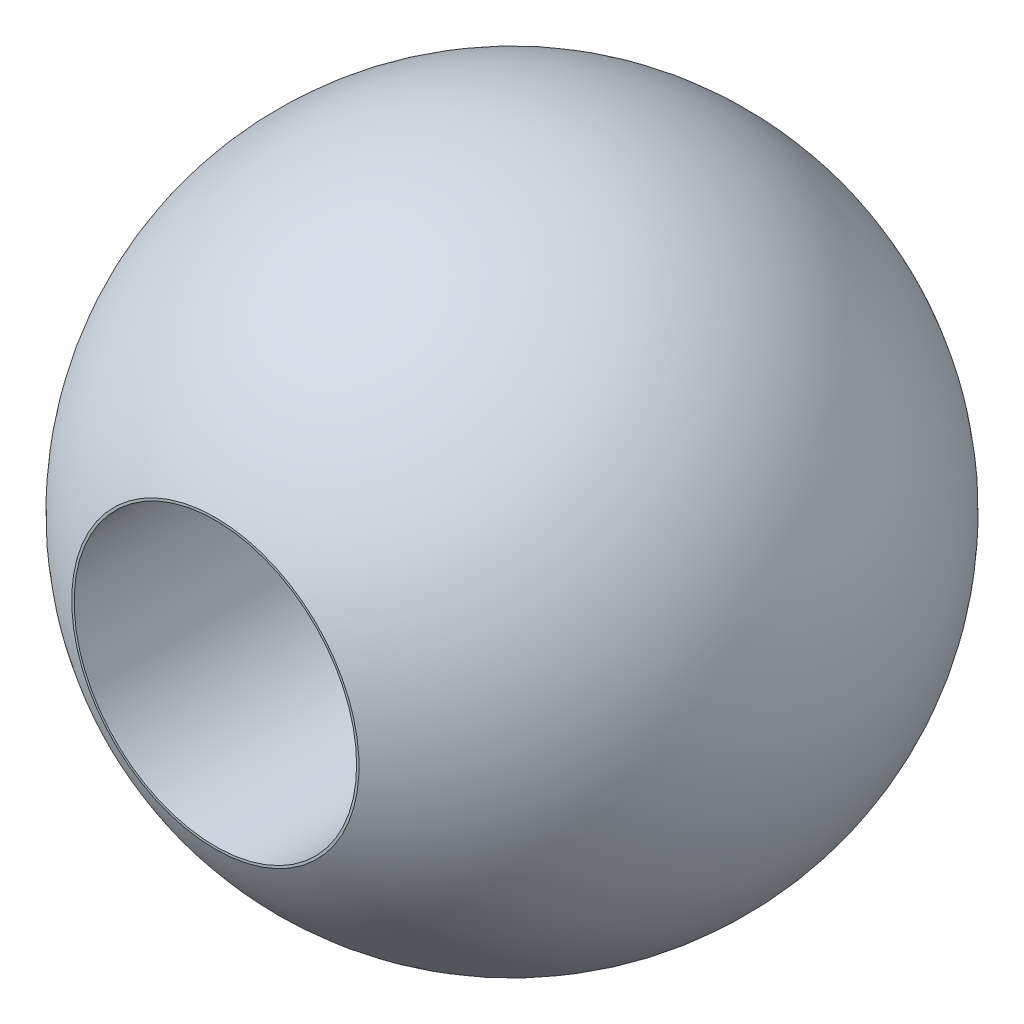
ISO-10303-21;
HEADER;
FILE_DESCRIPTION(('STEP AP214'),'2;1');
FILE_NAME('part.step','',(''),(''),'','','');
FILE_SCHEMA(('AUTOMOTIVE_DESIGN { 1 0 10303 214 1 1 1 1 }'));
ENDSEC;
DATA;
#1=APPLICATION_CONTEXT('core data for automotive mechanical design processes');
#2=APPLICATION_PROTOCOL_DEFINITION('international standard','automotive_design',2000,#1);
#3=PRODUCT_CONTEXT('',#1,'mechanical');
#4=PRODUCT('Part','Part','',(#3));
#5=PRODUCT_RELATED_PRODUCT_CATEGORY('part','',(#4));
#6=PRODUCT_DEFINITION_FORMATION('','',#4);
#7=PRODUCT_DEFINITION_CONTEXT('part definition',#1,'design');
#8=PRODUCT_DEFINITION('design','',#6,#7);
#9=PRODUCT_DEFINITION_SHAPE('','',#8);
#10=(LENGTH_UNIT() NAMED_UNIT(*) SI_UNIT(.MILLI.,.METRE.));
#11=(NAMED_UNIT(*) PLANE_ANGLE_UNIT() SI_UNIT($,.RADIAN.));
#12=(NAMED_UNIT(*) SI_UNIT($,.STERADIAN.) SOLID_ANGLE_UNIT());
#13=UNCERTAINTY_MEASURE_WITH_UNIT(LENGTH_MEASURE(1.E-05),#10,'distance_accuracy_value','');
#14=(GEOMETRIC_REPRESENTATION_CONTEXT(3) GLOBAL_UNCERTAINTY_ASSIGNED_CONTEXT((#13)) GLOBAL_UNIT_ASSIGNED_CONTEXT((#10,
#11,#12)) REPRESENTATION_CONTEXT('',''));
#15=CARTESIAN_POINT('',(0.,0.,0.));
#16=DIRECTION('',(0.,0.,1.));
#17=DIRECTION('',(1.,0.,0.));
#18=AXIS2_PLACEMENT_3D('',#15,#16,#17);
#19=CARTESIAN_POINT('',(0.,11.,0.));
#20=DIRECTION('',(0.,-1.,0.));
#21=DIRECTION('',(1.,0.,0.));
#22=AXIS2_PLACEMENT_3D('',#19,#20,#21);
#23=SPHERICAL_SURFACE('',#22,3.5);
#24=CARTESIAN_POINT('',(0.,11.,0.));
#25=DIRECTION('',(0.,0.,1.));
#26=DIRECTION('',(0.,-1.,0.));
#27=AXIS2_PLACEMENT_3D('',#24,#25,#26);
#28=SPHERICAL_SURFACE('',#27,3.5);
#29=CARTESIAN_POINT('',(0.,11.,-3.15));
#30=DIRECTION('',(0.,0.,1.));
#31=DIRECTION('',(0.,-1.,0.));
#32=AXIS2_PLACEMENT_3D('',#29,#30,#31);
#33=CIRCLE('',#32,1.52561463023923);
#34=CARTESIAN_POINT('',(0.,9.47438536976077,-3.15));
#35=VERTEX_POINT('',#34);
#36=EDGE_CURVE('E33',#35,#35,#33,.F.);
#37=ORIENTED_EDGE('',*,*,#36,.F.);
#38=EDGE_LOOP('',(#37));
#39=FACE_BOUND('',#38,.T.);
#40=CARTESIAN_POINT('',(0.,11.,3.15));
#41=DIRECTION('',(0.,0.,-1.));
#42=DIRECTION('',(0.,1.,0.));
#43=AXIS2_PLACEMENT_3D('',#40,#41,#42);
#44=CIRCLE('',#43,1.52561463023923);
#45=CARTESIAN_POINT('',(0.,12.5256146302392,3.15));
#46=VERTEX_POINT('',#45);
#47=EDGE_CURVE('E10',#46,#46,#44,.F.);
#48=ORIENTED_EDGE('',*,*,#47,.F.);
#49=EDGE_LOOP('',(#48));
#50=FACE_BOUND('',#49,.T.);
#51=ADVANCED_FACE('F30',(#39,#50),#28,.T.);
#52=CARTESIAN_POINT('',(-4.90000000000001,15.9,3.15));
#53=DIRECTION('',(0.,0.,-1.));
#54=DIRECTION('',(0.,1.,0.));
#55=AXIS2_PLACEMENT_3D('',#52,#53,#54);
#56=PLANE('',#55);
#57=CARTESIAN_POINT('',(0.,11.,3.15));
#58=DIRECTION('',(0.,0.,1.));
#59=DIRECTION('',(1.,0.,0.));
#60=AXIS2_PLACEMENT_3D('',#57,#58,#59);
#61=CIRCLE('',#60,1.5);
#62=CARTESIAN_POINT('',(1.49999999999999,11.,3.15));
#63=VERTEX_POINT('',#62);
#64=EDGE_CURVE('E44',#63,#63,#61,.T.);
#65=ORIENTED_EDGE('',*,*,#64,.F.);
#66=EDGE_LOOP('',(#65));
#67=FACE_BOUND('',#66,.T.);
#68=ORIENTED_EDGE('',*,*,#47,.T.);
#69=EDGE_LOOP('',(#68));
#70=FACE_BOUND('',#69,.T.);
#71=ADVANCED_FACE('F50',(#67,#70),#56,.F.);
#72=CARTESIAN_POINT('',(-4.90000000000001,15.9,-3.15));
#73=DIRECTION('',(0.,0.,1.));
#74=DIRECTION('',(0.,-1.,0.));
#75=AXIS2_PLACEMENT_3D('',#72,#73,#74);
#76=PLANE('',#75);
#77=CARTESIAN_POINT('',(0.,11.,-3.15));
#78=DIRECTION('',(0.,0.,1.));
#79=DIRECTION('',(1.,0.,0.));
#80=AXIS2_PLACEMENT_3D('',#77,#78,#79);
#81=CIRCLE('',#80,1.5);
#82=CARTESIAN_POINT('',(1.49999999999999,11.,-3.15));
#83=VERTEX_POINT('',#82);
#84=EDGE_CURVE('E40',#83,#83,#81,.T.);
#85=ORIENTED_EDGE('',*,*,#84,.T.);
#86=EDGE_LOOP('',(#85));
#87=FACE_BOUND('',#86,.T.);
#88=ORIENTED_EDGE('',*,*,#36,.T.);
#89=EDGE_LOOP('',(#88));
#90=FACE_BOUND('',#89,.T.);
#91=ADVANCED_FACE('F52',(#87,#90),#76,.F.);
#92=CARTESIAN_POINT('',(0.,11.,-3.15));
#93=DIRECTION('',(0.,0.,1.));
#94=DIRECTION('',(1.,0.,0.));
#95=AXIS2_PLACEMENT_3D('',#92,#93,#94);
#96=CYLINDRICAL_SURFACE('',#95,1.5);
#97=ORIENTED_EDGE('',*,*,#84,.F.);
#98=EDGE_LOOP('',(#97));
#99=FACE_BOUND('',#98,.T.);
#100=ORIENTED_EDGE('',*,*,#64,.T.);
#101=EDGE_LOOP('',(#100));
#102=FACE_BOUND('',#101,.T.);
#103=ADVANCED_FACE('F48',(#99,#102),#96,.F.);
#104=CLOSED_SHELL('',(#51,#71,#91,#103));
#105=MANIFOLD_SOLID_BREP('B2',#104);
#106=ADVANCED_BREP_SHAPE_REPRESENTATION('',(#18,#105),#14);
#107=SHAPE_DEFINITION_REPRESENTATION(#9,#106);
ENDSEC;
END-ISO-10303-21;
